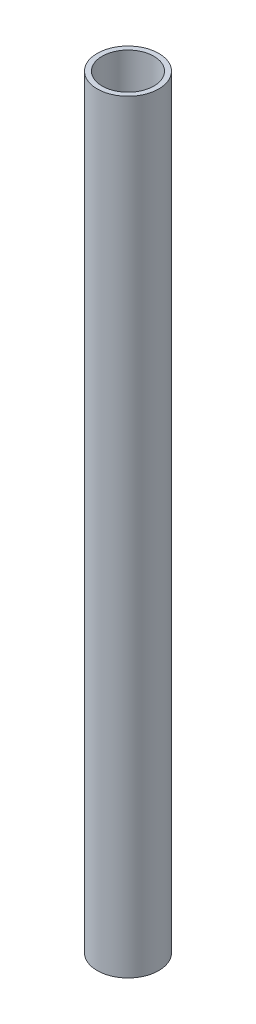
ISO-10303-21;
HEADER;
FILE_DESCRIPTION(('STEP AP214'),'2;1');
FILE_NAME('part.step','',(''),(''),'','','');
FILE_SCHEMA(('AUTOMOTIVE_DESIGN { 1 0 10303 214 1 1 1 1 }'));
ENDSEC;
DATA;
#1=APPLICATION_CONTEXT('core data for automotive mechanical design processes');
#2=APPLICATION_PROTOCOL_DEFINITION('international standard','automotive_design',2000,#1);
#3=PRODUCT_CONTEXT('',#1,'mechanical');
#4=PRODUCT('Part','Part','',(#3));
#5=PRODUCT_RELATED_PRODUCT_CATEGORY('part','',(#4));
#6=PRODUCT_DEFINITION_FORMATION('','',#4);
#7=PRODUCT_DEFINITION_CONTEXT('part definition',#1,'design');
#8=PRODUCT_DEFINITION('design','',#6,#7);
#9=PRODUCT_DEFINITION_SHAPE('','',#8);
#10=(LENGTH_UNIT() NAMED_UNIT(*) SI_UNIT(.MILLI.,.METRE.));
#11=(NAMED_UNIT(*) PLANE_ANGLE_UNIT() SI_UNIT($,.RADIAN.));
#12=(NAMED_UNIT(*) SI_UNIT($,.STERADIAN.) SOLID_ANGLE_UNIT());
#13=UNCERTAINTY_MEASURE_WITH_UNIT(LENGTH_MEASURE(1.E-05),#10,'distance_accuracy_value','');
#14=(GEOMETRIC_REPRESENTATION_CONTEXT(3) GLOBAL_UNCERTAINTY_ASSIGNED_CONTEXT((#13)) GLOBAL_UNIT_ASSIGNED_CONTEXT((#10,
#11,#12)) REPRESENTATION_CONTEXT('',''));
#15=CARTESIAN_POINT('',(0.,0.,0.));
#16=DIRECTION('',(0.,0.,1.));
#17=DIRECTION('',(1.,0.,0.));
#18=AXIS2_PLACEMENT_3D('',#15,#16,#17);
#19=CARTESIAN_POINT('',(0.,310.,0.));
#20=DIRECTION('',(0.,1.,0.));
#21=DIRECTION('',(0.,0.,1.));
#22=AXIS2_PLACEMENT_3D('',#19,#20,#21);
#23=PLANE('',#22);
#24=CARTESIAN_POINT('',(0.,310.,0.));
#25=DIRECTION('',(0.,1.,0.));
#26=DIRECTION('',(0.,0.,1.));
#27=AXIS2_PLACEMENT_3D('',#24,#25,#26);
#28=CIRCLE('',#27,12.5);
#29=CARTESIAN_POINT('',(0.,310.,12.5));
#30=VERTEX_POINT('',#29);
#31=EDGE_CURVE('E10',#30,#30,#28,.T.);
#32=ORIENTED_EDGE('',*,*,#31,.T.);
#33=EDGE_LOOP('',(#32));
#34=FACE_BOUND('',#33,.T.);
#35=CARTESIAN_POINT('',(0.,310.,0.));
#36=DIRECTION('',(0.,1.,0.));
#37=DIRECTION('',(0.,0.,1.));
#38=AXIS2_PLACEMENT_3D('',#35,#36,#37);
#39=CIRCLE('',#38,10.5);
#40=CARTESIAN_POINT('',(0.,310.,10.5));
#41=VERTEX_POINT('',#40);
#42=EDGE_CURVE('E42',#41,#41,#39,.T.);
#43=ORIENTED_EDGE('',*,*,#42,.F.);
#44=EDGE_LOOP('',(#43));
#45=FACE_BOUND('',#44,.T.);
#46=ADVANCED_FACE('F31',(#34,#45),#23,.T.);
#47=CARTESIAN_POINT('',(0.,0.,0.));
#48=DIRECTION('',(0.,1.,0.));
#49=DIRECTION('',(0.,0.,1.));
#50=AXIS2_PLACEMENT_3D('',#47,#48,#49);
#51=PLANE('',#50);
#52=CARTESIAN_POINT('',(0.,0.,0.));
#53=DIRECTION('',(0.,1.,0.));
#54=DIRECTION('',(0.,0.,1.));
#55=AXIS2_PLACEMENT_3D('',#52,#53,#54);
#56=CIRCLE('',#55,12.5);
#57=CARTESIAN_POINT('',(0.,0.,12.5));
#58=VERTEX_POINT('',#57);
#59=EDGE_CURVE('E35',#58,#58,#56,.T.);
#60=ORIENTED_EDGE('',*,*,#59,.F.);
#61=EDGE_LOOP('',(#60));
#62=FACE_BOUND('',#61,.T.);
#63=CARTESIAN_POINT('',(0.,0.,0.));
#64=DIRECTION('',(0.,1.,0.));
#65=DIRECTION('',(0.,0.,1.));
#66=AXIS2_PLACEMENT_3D('',#63,#64,#65);
#67=CIRCLE('',#66,10.5);
#68=CARTESIAN_POINT('',(0.,0.,10.5));
#69=VERTEX_POINT('',#68);
#70=EDGE_CURVE('E44',#69,#69,#67,.T.);
#71=ORIENTED_EDGE('',*,*,#70,.T.);
#72=EDGE_LOOP('',(#71));
#73=FACE_BOUND('',#72,.T.);
#74=ADVANCED_FACE('F54',(#62,#73),#51,.F.);
#75=CARTESIAN_POINT('',(0.,310.,0.));
#76=DIRECTION('',(0.,-1.,0.));
#77=DIRECTION('',(0.,0.,-1.));
#78=AXIS2_PLACEMENT_3D('',#75,#76,#77);
#79=CYLINDRICAL_SURFACE('',#78,12.5);
#80=ORIENTED_EDGE('',*,*,#31,.F.);
#81=EDGE_LOOP('',(#80));
#82=FACE_BOUND('',#81,.T.);
#83=ORIENTED_EDGE('',*,*,#59,.T.);
#84=EDGE_LOOP('',(#83));
#85=FACE_BOUND('',#84,.T.);
#86=ADVANCED_FACE('F33',(#82,#85),#79,.T.);
#87=CARTESIAN_POINT('',(0.,310.,0.));
#88=DIRECTION('',(0.,-1.,0.));
#89=DIRECTION('',(0.,0.,-1.));
#90=AXIS2_PLACEMENT_3D('',#87,#88,#89);
#91=CYLINDRICAL_SURFACE('',#90,10.5);
#92=ORIENTED_EDGE('',*,*,#42,.T.);
#93=EDGE_LOOP('',(#92));
#94=FACE_BOUND('',#93,.T.);
#95=ORIENTED_EDGE('',*,*,#70,.F.);
#96=EDGE_LOOP('',(#95));
#97=FACE_BOUND('',#96,.T.);
#98=ADVANCED_FACE('F50',(#94,#97),#91,.F.);
#99=CLOSED_SHELL('',(#46,#74,#86,#98));
#100=MANIFOLD_SOLID_BREP('B2',#99);
#101=ADVANCED_BREP_SHAPE_REPRESENTATION('',(#18,#100),#14);
#102=SHAPE_DEFINITION_REPRESENTATION(#9,#101);
ENDSEC;
END-ISO-10303-21;
